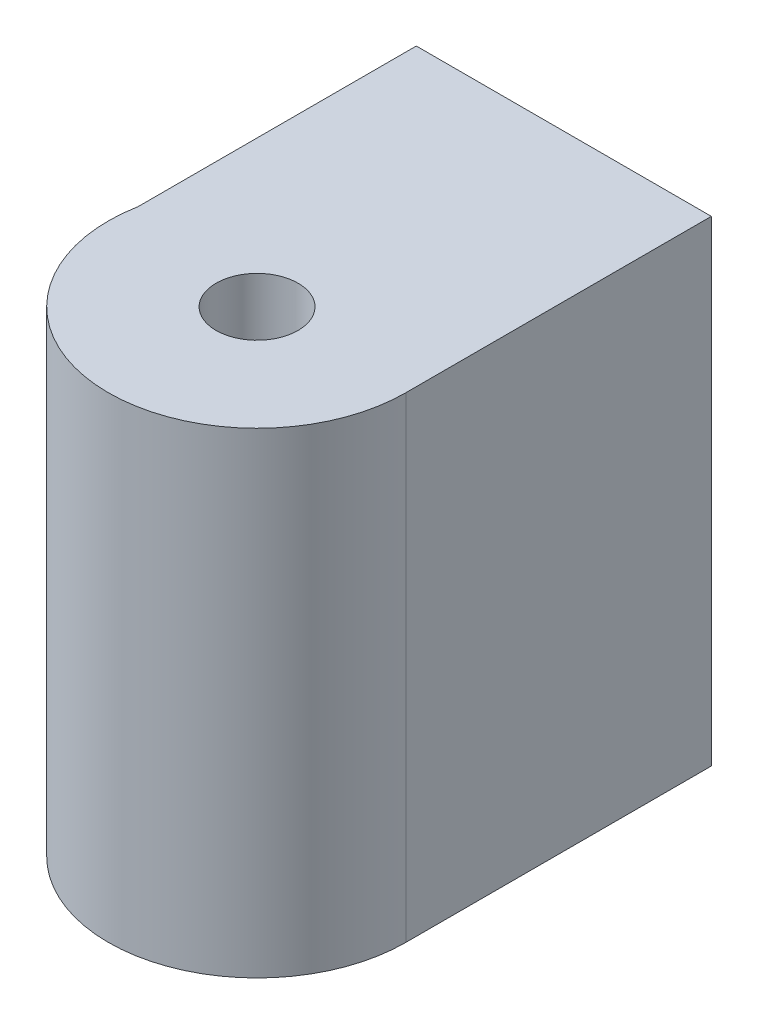
ISO-10303-21;
HEADER;
FILE_DESCRIPTION(('STEP AP214'),'2;1');
FILE_NAME('part.step','',(''),(''),'','','');
FILE_SCHEMA(('AUTOMOTIVE_DESIGN { 1 0 10303 214 1 1 1 1 }'));
ENDSEC;
DATA;
#1=APPLICATION_CONTEXT('core data for automotive mechanical design processes');
#2=APPLICATION_PROTOCOL_DEFINITION('international standard','automotive_design',2000,#1);
#3=PRODUCT_CONTEXT('',#1,'mechanical');
#4=PRODUCT('Part','Part','',(#3));
#5=PRODUCT_RELATED_PRODUCT_CATEGORY('part','',(#4));
#6=PRODUCT_DEFINITION_FORMATION('','',#4);
#7=PRODUCT_DEFINITION_CONTEXT('part definition',#1,'design');
#8=PRODUCT_DEFINITION('design','',#6,#7);
#9=PRODUCT_DEFINITION_SHAPE('','',#8);
#10=(LENGTH_UNIT() NAMED_UNIT(*) SI_UNIT(.MILLI.,.METRE.));
#11=(NAMED_UNIT(*) PLANE_ANGLE_UNIT() SI_UNIT($,.RADIAN.));
#12=(NAMED_UNIT(*) SI_UNIT($,.STERADIAN.) SOLID_ANGLE_UNIT());
#13=UNCERTAINTY_MEASURE_WITH_UNIT(LENGTH_MEASURE(1.E-05),#10,'distance_accuracy_value','');
#14=(GEOMETRIC_REPRESENTATION_CONTEXT(3) GLOBAL_UNCERTAINTY_ASSIGNED_CONTEXT((#13)) GLOBAL_UNIT_ASSIGNED_CONTEXT((#10,
#11,#12)) REPRESENTATION_CONTEXT('',''));
#15=CARTESIAN_POINT('',(0.,0.,0.));
#16=DIRECTION('',(0.,0.,1.));
#17=DIRECTION('',(1.,0.,0.));
#18=AXIS2_PLACEMENT_3D('',#15,#16,#17);
#19=CARTESIAN_POINT('',(-53.6939675410073,-2070.74992623645,-163.840329353942));
#20=DIRECTION('',(0.,-1.,0.));
#21=DIRECTION('',(1.,0.,0.));
#22=AXIS2_PLACEMENT_3D('',#19,#20,#21);
#23=CYLINDRICAL_SURFACE('',#22,12.7);
#24=CARTESIAN_POINT('',(-53.6939675410073,-2070.74992623645,-163.840329353942));
#25=DIRECTION('',(0.,1.,0.));
#26=DIRECTION('',(-1.,0.,0.));
#27=AXIS2_PLACEMENT_3D('',#24,#25,#26);
#28=CIRCLE('',#27,12.7);
#29=CARTESIAN_POINT('',(-66.179661452878,-2070.74992623645,-166.163570094605));
#30=VERTEX_POINT('',#29);
#31=CARTESIAN_POINT('',(-40.9939675410073,-2070.74992623645,-163.840329353942));
#32=VERTEX_POINT('',#31);
#33=EDGE_CURVE('E11',#30,#32,#28,.T.);
#34=ORIENTED_EDGE('',*,*,#33,.F.);
#35=DIRECTION('',(0.,-1.,0.));
#36=VECTOR('',#35,1.);
#37=CARTESIAN_POINT('',(-66.179661452878,-2101.38992623645,-166.163570094605));
#38=LINE('',#37,#36);
#39=CARTESIAN_POINT('',(-66.179661452878,-2111.38992623645,-166.163570094605));
#40=VERTEX_POINT('',#39);
#41=EDGE_CURVE('E46',#30,#40,#38,.T.);
#42=ORIENTED_EDGE('',*,*,#41,.T.);
#43=CARTESIAN_POINT('',(-53.6939675410073,-2111.38992623645,-163.840329353942));
#44=DIRECTION('',(0.,1.,0.));
#45=DIRECTION('',(-1.,0.,0.));
#46=AXIS2_PLACEMENT_3D('',#43,#44,#45);
#47=CIRCLE('',#46,12.7);
#48=CARTESIAN_POINT('',(-40.9939675410073,-2111.38992623645,-163.840329353942));
#49=VERTEX_POINT('',#48);
#50=EDGE_CURVE('E35',#40,#49,#47,.T.);
#51=ORIENTED_EDGE('',*,*,#50,.T.);
#52=DIRECTION('',(0.,-1.,0.));
#53=VECTOR('',#52,1.);
#54=CARTESIAN_POINT('',(-40.9939675410073,-2101.38992623645,-163.840329353942));
#55=LINE('',#54,#53);
#56=EDGE_CURVE('E53',#32,#49,#55,.T.);
#57=ORIENTED_EDGE('',*,*,#56,.F.);
#58=EDGE_LOOP('',(#34,#42,#51,#57));
#59=FACE_BOUND('',#58,.T.);
#60=ADVANCED_FACE('F32',(#59),#23,.T.);
#61=CARTESIAN_POINT('',(-53.6939675410073,-2070.74992623645,-163.840329353942));
#62=DIRECTION('',(0.,1.,0.));
#63=DIRECTION('',(-1.,0.,0.));
#64=AXIS2_PLACEMENT_3D('',#61,#62,#63);
#65=PLANE('',#64);
#66=ORIENTED_EDGE('',*,*,#33,.T.);
#67=DIRECTION('',(0.,0.,-1.));
#68=VECTOR('',#67,1.);
#69=CARTESIAN_POINT('',(-40.9939675410073,-2070.74992623645,-163.840329353942));
#70=LINE('',#69,#68);
#71=CARTESIAN_POINT('',(-40.9939675410073,-2070.74992623645,-189.919076926774));
#72=VERTEX_POINT('',#71);
#73=EDGE_CURVE('E151',#32,#72,#70,.T.);
#74=ORIENTED_EDGE('',*,*,#73,.T.);
#75=DIRECTION('',(-1.,0.,0.));
#76=VECTOR('',#75,1.);
#77=CARTESIAN_POINT('',(-66.179661452878,-2070.74992623645,-189.919076926774));
#78=LINE('',#77,#76);
#79=CARTESIAN_POINT('',(-66.179661452878,-2070.74992623645,-189.919076926774));
#80=VERTEX_POINT('',#79);
#81=EDGE_CURVE('E156',#72,#80,#78,.T.);
#82=ORIENTED_EDGE('',*,*,#81,.T.);
#83=DIRECTION('',(0.,0.,1.));
#84=VECTOR('',#83,1.);
#85=CARTESIAN_POINT('',(-66.179661452878,-2070.74992623645,-163.840329353942));
#86=LINE('',#85,#84);
#87=EDGE_CURVE('E152',#80,#30,#86,.T.);
#88=ORIENTED_EDGE('',*,*,#87,.T.);
#89=EDGE_LOOP('',(#66,#74,#82,#88));
#90=FACE_BOUND('',#89,.T.);
#91=CARTESIAN_POINT('',(-53.6939675410073,-2070.74992623645,-163.840329353942));
#92=DIRECTION('',(0.,1.,0.));
#93=DIRECTION('',(0.,0.,1.));
#94=AXIS2_PLACEMENT_3D('',#91,#92,#93);
#95=CIRCLE('',#94,3.5);
#96=CARTESIAN_POINT('',(-53.6939675410073,-2070.74992623645,-160.340329353942));
#97=VERTEX_POINT('',#96);
#98=EDGE_CURVE('E179',#97,#97,#95,.T.);
#99=ORIENTED_EDGE('',*,*,#98,.F.);
#100=EDGE_LOOP('',(#99));
#101=FACE_BOUND('',#100,.T.);
#102=ADVANCED_FACE('F212',(#90,#101),#65,.T.);
#103=CARTESIAN_POINT('',(-53.6939675410073,-2111.38992623645,-163.840329353942));
#104=DIRECTION('',(0.,1.,0.));
#105=DIRECTION('',(-1.,0.,0.));
#106=AXIS2_PLACEMENT_3D('',#103,#104,#105);
#107=PLANE('',#106);
#108=CARTESIAN_POINT('',(-61.9428595120541,-2111.38992623645,-159.077829353942));
#109=DIRECTION('',(0.,-1.,0.));
#110=DIRECTION('',(0.,0.,-1.));
#111=AXIS2_PLACEMENT_3D('',#108,#109,#110);
#112=CIRCLE('',#111,1.77799999999999);
#113=CARTESIAN_POINT('',(-61.9428595120541,-2111.38992623645,-160.855829353942));
#114=VERTEX_POINT('',#113);
#115=EDGE_CURVE('E180',#114,#114,#112,.T.);
#116=ORIENTED_EDGE('',*,*,#115,.F.);
#117=EDGE_LOOP('',(#116));
#118=FACE_BOUND('',#117,.T.);
#119=CARTESIAN_POINT('',(-53.6939675410073,-2111.38992623645,-173.365329353942));
#120=DIRECTION('',(0.,-1.,0.));
#121=DIRECTION('',(0.,0.,-1.));
#122=AXIS2_PLACEMENT_3D('',#119,#120,#121);
#123=CIRCLE('',#122,1.778);
#124=CARTESIAN_POINT('',(-53.6939675410073,-2111.38992623645,-175.143329353942));
#125=VERTEX_POINT('',#124);
#126=EDGE_CURVE('E186',#125,#125,#123,.T.);
#127=ORIENTED_EDGE('',*,*,#126,.F.);
#128=EDGE_LOOP('',(#127));
#129=FACE_BOUND('',#128,.T.);
#130=CARTESIAN_POINT('',(-45.4450755699605,-2111.38992623645,-159.077829353942));
#131=DIRECTION('',(0.,-1.,0.));
#132=DIRECTION('',(0.,0.,-1.));
#133=AXIS2_PLACEMENT_3D('',#130,#131,#132);
#134=CIRCLE('',#133,1.77799999999999);
#135=CARTESIAN_POINT('',(-45.4450755699605,-2111.38992623645,-160.855829353942));
#136=VERTEX_POINT('',#135);
#137=EDGE_CURVE('E174',#136,#136,#134,.T.);
#138=ORIENTED_EDGE('',*,*,#137,.F.);
#139=EDGE_LOOP('',(#138));
#140=FACE_BOUND('',#139,.T.);
#141=CARTESIAN_POINT('',(-53.6939675410073,-2111.38992623645,-163.840329353942));
#142=DIRECTION('',(0.,1.,0.));
#143=DIRECTION('',(-1.,0.,0.));
#144=AXIS2_PLACEMENT_3D('',#141,#142,#143);
#145=CIRCLE('',#144,3.5);
#146=CARTESIAN_POINT('',(-57.1939675410073,-2111.38992623645,-163.840329353942));
#147=VERTEX_POINT('',#146);
#148=EDGE_CURVE('E196',#147,#147,#145,.F.);
#149=ORIENTED_EDGE('',*,*,#148,.F.);
#150=EDGE_LOOP('',(#149));
#151=FACE_BOUND('',#150,.T.);
#152=ORIENTED_EDGE('',*,*,#50,.F.);
#153=DIRECTION('',(0.,0.,-1.));
#154=VECTOR('',#153,1.);
#155=CARTESIAN_POINT('',(-66.179661452878,-2111.38992623645,-166.163570094605));
#156=LINE('',#155,#154);
#157=CARTESIAN_POINT('',(-66.179661452878,-2111.38992623645,-189.919076926775));
#158=VERTEX_POINT('',#157);
#159=EDGE_CURVE('E168',#40,#158,#156,.T.);
#160=ORIENTED_EDGE('',*,*,#159,.T.);
#161=DIRECTION('',(1.,0.,0.));
#162=VECTOR('',#161,1.);
#163=CARTESIAN_POINT('',(-40.9939675410073,-2111.38992623645,-189.919076926775));
#164=LINE('',#163,#162);
#165=CARTESIAN_POINT('',(-40.9939675410073,-2111.38992623645,-189.919076926775));
#166=VERTEX_POINT('',#165);
#167=EDGE_CURVE('E163',#158,#166,#164,.T.);
#168=ORIENTED_EDGE('',*,*,#167,.T.);
#169=DIRECTION('',(0.,0.,1.));
#170=VECTOR('',#169,1.);
#171=CARTESIAN_POINT('',(-40.9939675410073,-2111.38992623645,-163.840329353942));
#172=LINE('',#171,#170);
#173=EDGE_CURVE('E170',#166,#49,#172,.T.);
#174=ORIENTED_EDGE('',*,*,#173,.T.);
#175=EDGE_LOOP('',(#152,#160,#168,#174));
#176=FACE_BOUND('',#175,.T.);
#177=ADVANCED_FACE('F205',(#118,#129,#140,#151,#176),#107,.F.);
#178=CARTESIAN_POINT('',(-53.6939675410073,-2121.28942117306,-163.840329353942));
#179=DIRECTION('',(0.,1.,0.));
#180=DIRECTION('',(0.,0.,1.));
#181=AXIS2_PLACEMENT_3D('',#178,#179,#180);
#182=CYLINDRICAL_SURFACE('',#181,3.5);
#183=ORIENTED_EDGE('',*,*,#148,.T.);
#184=EDGE_LOOP('',(#183));
#185=FACE_BOUND('',#184,.T.);
#186=ORIENTED_EDGE('',*,*,#98,.T.);
#187=EDGE_LOOP('',(#186));
#188=FACE_BOUND('',#187,.T.);
#189=ADVANCED_FACE('F218',(#185,#188),#182,.F.);
#190=CARTESIAN_POINT('',(-45.4450755699605,-2105.38992623645,-159.077829353942));
#191=DIRECTION('',(0.,-1.,0.));
#192=DIRECTION('',(0.,0.,-1.));
#193=AXIS2_PLACEMENT_3D('',#190,#191,#192);
#194=CYLINDRICAL_SURFACE('',#193,1.77799999999999);
#195=CARTESIAN_POINT('',(-45.4450755699605,-2105.38992623645,-159.077829353942));
#196=DIRECTION('',(0.,-1.,0.));
#197=DIRECTION('',(0.,0.,-1.));
#198=AXIS2_PLACEMENT_3D('',#195,#196,#197);
#199=CIRCLE('',#198,1.77799999999999);
#200=CARTESIAN_POINT('',(-45.4450755699605,-2105.38992623645,-160.855829353942));
#201=VERTEX_POINT('',#200);
#202=EDGE_CURVE('E189',#201,#201,#199,.T.);
#203=ORIENTED_EDGE('',*,*,#202,.F.);
#204=EDGE_LOOP('',(#203));
#205=FACE_BOUND('',#204,.T.);
#206=ORIENTED_EDGE('',*,*,#137,.T.);
#207=EDGE_LOOP('',(#206));
#208=FACE_BOUND('',#207,.T.);
#209=ADVANCED_FACE('F220',(#205,#208),#194,.F.);
#210=CARTESIAN_POINT('',(-45.4450755699605,-2105.38992623645,-159.077829353942));
#211=DIRECTION('',(0.,-1.,0.));
#212=DIRECTION('',(0.,0.,-1.));
#213=AXIS2_PLACEMENT_3D('',#210,#211,#212);
#214=PLANE('',#213);
#215=ORIENTED_EDGE('',*,*,#202,.T.);
#216=EDGE_LOOP('',(#215));
#217=FACE_BOUND('',#216,.T.);
#218=ADVANCED_FACE('F226',(#217),#214,.T.);
#219=CARTESIAN_POINT('',(-53.6939675410073,-2105.38992623645,-173.365329353942));
#220=DIRECTION('',(0.,-1.,0.));
#221=DIRECTION('',(0.,0.,-1.));
#222=AXIS2_PLACEMENT_3D('',#219,#220,#221);
#223=CYLINDRICAL_SURFACE('',#222,1.778);
#224=CARTESIAN_POINT('',(-53.6939675410073,-2105.38992623645,-173.365329353942));
#225=DIRECTION('',(0.,-1.,0.));
#226=DIRECTION('',(0.,0.,-1.));
#227=AXIS2_PLACEMENT_3D('',#224,#225,#226);
#228=CIRCLE('',#227,1.778);
#229=CARTESIAN_POINT('',(-53.6939675410073,-2105.38992623645,-175.143329353942));
#230=VERTEX_POINT('',#229);
#231=EDGE_CURVE('E183',#230,#230,#228,.T.);
#232=ORIENTED_EDGE('',*,*,#231,.F.);
#233=EDGE_LOOP('',(#232));
#234=FACE_BOUND('',#233,.T.);
#235=ORIENTED_EDGE('',*,*,#126,.T.);
#236=EDGE_LOOP('',(#235));
#237=FACE_BOUND('',#236,.T.);
#238=ADVANCED_FACE('F276',(#234,#237),#223,.F.);
#239=CARTESIAN_POINT('',(-53.6939675410073,-2105.38992623645,-173.365329353942));
#240=DIRECTION('',(0.,-1.,0.));
#241=DIRECTION('',(0.,0.,-1.));
#242=AXIS2_PLACEMENT_3D('',#239,#240,#241);
#243=PLANE('',#242);
#244=ORIENTED_EDGE('',*,*,#231,.T.);
#245=EDGE_LOOP('',(#244));
#246=FACE_BOUND('',#245,.T.);
#247=ADVANCED_FACE('F266',(#246),#243,.T.);
#248=CARTESIAN_POINT('',(-61.9428595120541,-2105.38992623645,-159.077829353942));
#249=DIRECTION('',(0.,-1.,0.));
#250=DIRECTION('',(0.,0.,-1.));
#251=AXIS2_PLACEMENT_3D('',#248,#249,#250);
#252=CYLINDRICAL_SURFACE('',#251,1.77799999999999);
#253=CARTESIAN_POINT('',(-61.9428595120541,-2105.38992623645,-159.077829353942));
#254=DIRECTION('',(0.,-1.,0.));
#255=DIRECTION('',(0.,0.,-1.));
#256=AXIS2_PLACEMENT_3D('',#253,#254,#255);
#257=CIRCLE('',#256,1.77799999999999);
#258=CARTESIAN_POINT('',(-61.9428595120541,-2105.38992623645,-160.855829353942));
#259=VERTEX_POINT('',#258);
#260=EDGE_CURVE('E176',#259,#259,#257,.T.);
#261=ORIENTED_EDGE('',*,*,#260,.F.);
#262=EDGE_LOOP('',(#261));
#263=FACE_BOUND('',#262,.T.);
#264=ORIENTED_EDGE('',*,*,#115,.T.);
#265=EDGE_LOOP('',(#264));
#266=FACE_BOUND('',#265,.T.);
#267=ADVANCED_FACE('F255',(#263,#266),#252,.F.);
#268=CARTESIAN_POINT('',(-61.9428595120541,-2105.38992623645,-159.077829353942));
#269=DIRECTION('',(0.,-1.,0.));
#270=DIRECTION('',(0.,0.,-1.));
#271=AXIS2_PLACEMENT_3D('',#268,#269,#270);
#272=PLANE('',#271);
#273=ORIENTED_EDGE('',*,*,#260,.T.);
#274=EDGE_LOOP('',(#273));
#275=FACE_BOUND('',#274,.T.);
#276=ADVANCED_FACE('F250',(#275),#272,.T.);
#277=CARTESIAN_POINT('',(-40.9939675410073,-2101.38992623645,-163.840329353942));
#278=DIRECTION('',(1.,0.,0.));
#279=DIRECTION('',(0.,1.,0.));
#280=AXIS2_PLACEMENT_3D('',#277,#278,#279);
#281=PLANE('',#280);
#282=ORIENTED_EDGE('',*,*,#173,.F.);
#283=DIRECTION('',(0.,1.,0.));
#284=VECTOR('',#283,1.);
#285=CARTESIAN_POINT('',(-40.9939675410073,-2101.38992623645,-189.919076926775));
#286=LINE('',#285,#284);
#287=EDGE_CURVE('E166',#166,#72,#286,.T.);
#288=ORIENTED_EDGE('',*,*,#287,.T.);
#289=ORIENTED_EDGE('',*,*,#73,.F.);
#290=ORIENTED_EDGE('',*,*,#56,.T.);
#291=EDGE_LOOP('',(#282,#288,#289,#290));
#292=FACE_BOUND('',#291,.T.);
#293=ADVANCED_FACE('F203',(#292),#281,.T.);
#294=CARTESIAN_POINT('',(-66.179661452878,-2101.38992623645,-166.163570094605));
#295=DIRECTION('',(-1.,0.,0.));
#296=DIRECTION('',(0.,-1.,0.));
#297=AXIS2_PLACEMENT_3D('',#294,#295,#296);
#298=PLANE('',#297);
#299=ORIENTED_EDGE('',*,*,#159,.F.);
#300=ORIENTED_EDGE('',*,*,#41,.F.);
#301=ORIENTED_EDGE('',*,*,#87,.F.);
#302=DIRECTION('',(0.,-1.,0.));
#303=VECTOR('',#302,1.);
#304=CARTESIAN_POINT('',(-66.179661452878,-2101.38992623645,-189.919076926775));
#305=LINE('',#304,#303);
#306=EDGE_CURVE('E155',#80,#158,#305,.T.);
#307=ORIENTED_EDGE('',*,*,#306,.T.);
#308=EDGE_LOOP('',(#299,#300,#301,#307));
#309=FACE_BOUND('',#308,.T.);
#310=ADVANCED_FACE('F210',(#309),#298,.T.);
#311=CARTESIAN_POINT('',(399.459604492078,-1664.88134965421,-189.919076926775));
#312=DIRECTION('',(0.,0.,1.));
#313=DIRECTION('',(-0.9999980793749,-0.00195990982184696,0.));
#314=AXIS2_PLACEMENT_3D('',#311,#312,#313);
#315=PLANE('',#314);
#316=CARTESIAN_POINT('',(-53.586814498129,-2106.38992623204,-189.919076926774));
#317=DIRECTION('',(0.,0.,-1.));
#318=DIRECTION('',(0.,1.,0.));
#319=AXIS2_PLACEMENT_3D('',#316,#317,#318);
#320=CIRCLE('',#319,3.15);
#321=CARTESIAN_POINT('',(-53.586814498129,-2103.23992623204,-189.919076926774));
#322=VERTEX_POINT('',#321);
#323=EDGE_CURVE('E106',#322,#322,#320,.T.);
#324=ORIENTED_EDGE('',*,*,#323,.F.);
#325=EDGE_LOOP('',(#324));
#326=FACE_BOUND('',#325,.T.);
#327=CARTESIAN_POINT('',(-62.6263575121822,-2106.38992623204,-189.919076926774));
#328=DIRECTION('',(0.,0.,-1.));
#329=DIRECTION('',(0.,1.,0.));
#330=AXIS2_PLACEMENT_3D('',#327,#328,#329);
#331=CIRCLE('',#330,3.15);
#332=CARTESIAN_POINT('',(-62.6263575121822,-2103.23992623204,-189.919076926774));
#333=VERTEX_POINT('',#332);
#334=EDGE_CURVE('E99',#333,#333,#331,.T.);
#335=ORIENTED_EDGE('',*,*,#334,.F.);
#336=EDGE_LOOP('',(#335));
#337=FACE_BOUND('',#336,.T.);
#338=CARTESIAN_POINT('',(-44.5472714840758,-2106.38992623204,-189.919076926774));
#339=DIRECTION('',(0.,0.,-1.));
#340=DIRECTION('',(0.,1.,0.));
#341=AXIS2_PLACEMENT_3D('',#338,#339,#340);
#342=CIRCLE('',#341,3.15);
#343=CARTESIAN_POINT('',(-44.5472714840758,-2103.23992623204,-189.919076926774));
#344=VERTEX_POINT('',#343);
#345=EDGE_CURVE('E115',#344,#344,#342,.T.);
#346=ORIENTED_EDGE('',*,*,#345,.F.);
#347=EDGE_LOOP('',(#346));
#348=FACE_BOUND('',#347,.T.);
#349=CARTESIAN_POINT('',(-53.586814498129,-2075.74992623645,-189.919076926774));
#350=DIRECTION('',(0.,0.,-1.));
#351=DIRECTION('',(0.,1.,0.));
#352=AXIS2_PLACEMENT_3D('',#349,#350,#351);
#353=CIRCLE('',#352,3.15);
#354=CARTESIAN_POINT('',(-53.586814498129,-2072.59992623645,-189.919076926774));
#355=VERTEX_POINT('',#354);
#356=EDGE_CURVE('E124',#355,#355,#353,.T.);
#357=ORIENTED_EDGE('',*,*,#356,.F.);
#358=EDGE_LOOP('',(#357));
#359=FACE_BOUND('',#358,.T.);
#360=CARTESIAN_POINT('',(-62.6263575121823,-2075.74992623645,-189.919076926774));
#361=DIRECTION('',(0.,0.,-1.));
#362=DIRECTION('',(0.,1.,0.));
#363=AXIS2_PLACEMENT_3D('',#360,#361,#362);
#364=CIRCLE('',#363,3.15);
#365=CARTESIAN_POINT('',(-62.6263575121823,-2072.59992623645,-189.919076926774));
#366=VERTEX_POINT('',#365);
#367=EDGE_CURVE('E133',#366,#366,#364,.T.);
#368=ORIENTED_EDGE('',*,*,#367,.F.);
#369=EDGE_LOOP('',(#368));
#370=FACE_BOUND('',#369,.T.);
#371=CARTESIAN_POINT('',(-44.5472714840758,-2075.74992623645,-189.919076926774));
#372=DIRECTION('',(0.,0.,-1.));
#373=DIRECTION('',(0.,1.,0.));
#374=AXIS2_PLACEMENT_3D('',#371,#372,#373);
#375=CIRCLE('',#374,3.15);
#376=CARTESIAN_POINT('',(-44.5472714840758,-2072.59992623645,-189.919076926774));
#377=VERTEX_POINT('',#376);
#378=EDGE_CURVE('E142',#377,#377,#375,.T.);
#379=ORIENTED_EDGE('',*,*,#378,.F.);
#380=EDGE_LOOP('',(#379));
#381=FACE_BOUND('',#380,.T.);
#382=ORIENTED_EDGE('',*,*,#167,.F.);
#383=ORIENTED_EDGE('',*,*,#306,.F.);
#384=ORIENTED_EDGE('',*,*,#81,.F.);
#385=ORIENTED_EDGE('',*,*,#287,.F.);
#386=EDGE_LOOP('',(#382,#383,#384,#385));
#387=FACE_BOUND('',#386,.T.);
#388=ADVANCED_FACE('F208',(#326,#337,#348,#359,#370,#381,#387),#315,.F.);
#389=CARTESIAN_POINT('',(-44.5472714840758,-2075.74992623645,-180.940539979121));
#390=DIRECTION('',(0.,0.,-1.));
#391=DIRECTION('',(0.,1.,0.));
#392=AXIS2_PLACEMENT_3D('',#389,#390,#391);
#393=CONICAL_SURFACE('',#392,1.7,1.02974425867666);
#394=CARTESIAN_POINT('',(-44.5472714840758,-2075.74992623645,-179.919076926774));
#395=VERTEX_POINT('',#394);
#396=VERTEX_LOOP('',#395);
#397=FACE_BOUND('',#396,.T.);
#398=CARTESIAN_POINT('',(-44.5472714840758,-2075.74992623645,-180.940539979121));
#399=DIRECTION('',(0.,0.,-1.));
#400=DIRECTION('',(0.,1.,0.));
#401=AXIS2_PLACEMENT_3D('',#398,#399,#400);
#402=CIRCLE('',#401,1.7);
#403=CARTESIAN_POINT('',(-44.5472714840758,-2074.04992623645,-180.940539979121));
#404=VERTEX_POINT('',#403);
#405=EDGE_CURVE('E148',#404,#404,#402,.T.);
#406=ORIENTED_EDGE('',*,*,#405,.T.);
#407=EDGE_LOOP('',(#406));
#408=FACE_BOUND('',#407,.T.);
#409=ADVANCED_FACE('F347',(#397,#408),#393,.F.);
#410=CARTESIAN_POINT('',(-44.5472714840758,-2075.74992623645,-189.919076926774));
#411=DIRECTION('',(0.,0.,-1.));
#412=DIRECTION('',(0.,1.,0.));
#413=AXIS2_PLACEMENT_3D('',#410,#411,#412);
#414=CYLINDRICAL_SURFACE('',#413,1.7);
#415=ORIENTED_EDGE('',*,*,#405,.F.);
#416=EDGE_LOOP('',(#415));
#417=FACE_BOUND('',#416,.T.);
#418=CARTESIAN_POINT('',(-44.5472714840758,-2075.74992623645,-188.469076926774));
#419=DIRECTION('',(0.,0.,-1.));
#420=DIRECTION('',(0.,1.,0.));
#421=AXIS2_PLACEMENT_3D('',#418,#419,#420);
#422=CIRCLE('',#421,1.69999999999999);
#423=CARTESIAN_POINT('',(-44.5472714840758,-2074.04992623645,-188.469076926774));
#424=VERTEX_POINT('',#423);
#425=EDGE_CURVE('E145',#424,#424,#422,.T.);
#426=ORIENTED_EDGE('',*,*,#425,.T.);
#427=EDGE_LOOP('',(#426));
#428=FACE_BOUND('',#427,.T.);
#429=ADVANCED_FACE('F357',(#417,#428),#414,.F.);
#430=CARTESIAN_POINT('',(-44.5472714840758,-2075.74992623645,-189.919076926774));
#431=DIRECTION('',(0.,0.,-1.));
#432=DIRECTION('',(0.,1.,0.));
#433=AXIS2_PLACEMENT_3D('',#430,#431,#432);
#434=CONICAL_SURFACE('',#433,3.15,0.785398163397448);
#435=ORIENTED_EDGE('',*,*,#425,.F.);
#436=EDGE_LOOP('',(#435));
#437=FACE_BOUND('',#436,.T.);
#438=ORIENTED_EDGE('',*,*,#378,.T.);
#439=EDGE_LOOP('',(#438));
#440=FACE_BOUND('',#439,.T.);
#441=ADVANCED_FACE('F366',(#437,#440),#434,.F.);
#442=CARTESIAN_POINT('',(-62.6263575121823,-2075.74992623645,-180.940539979121));
#443=DIRECTION('',(0.,0.,-1.));
#444=DIRECTION('',(0.,1.,0.));
#445=AXIS2_PLACEMENT_3D('',#442,#443,#444);
#446=CONICAL_SURFACE('',#445,1.7,1.02974425867666);
#447=CARTESIAN_POINT('',(-62.6263575121823,-2075.74992623645,-179.919076926774));
#448=VERTEX_POINT('',#447);
#449=VERTEX_LOOP('',#448);
#450=FACE_BOUND('',#449,.T.);
#451=CARTESIAN_POINT('',(-62.6263575121823,-2075.74992623645,-180.940539979121));
#452=DIRECTION('',(0.,0.,-1.));
#453=DIRECTION('',(0.,1.,0.));
#454=AXIS2_PLACEMENT_3D('',#451,#452,#453);
#455=CIRCLE('',#454,1.7);
#456=CARTESIAN_POINT('',(-62.6263575121823,-2074.04992623645,-180.940539979121));
#457=VERTEX_POINT('',#456);
#458=EDGE_CURVE('E139',#457,#457,#455,.T.);
#459=ORIENTED_EDGE('',*,*,#458,.T.);
#460=EDGE_LOOP('',(#459));
#461=FACE_BOUND('',#460,.T.);
#462=ADVANCED_FACE('F375',(#450,#461),#446,.F.);
#463=CARTESIAN_POINT('',(-62.6263575121823,-2075.74992623645,-189.919076926774));
#464=DIRECTION('',(0.,0.,-1.));
#465=DIRECTION('',(0.,1.,0.));
#466=AXIS2_PLACEMENT_3D('',#463,#464,#465);
#467=CYLINDRICAL_SURFACE('',#466,1.7);
#468=ORIENTED_EDGE('',*,*,#458,.F.);
#469=EDGE_LOOP('',(#468));
#470=FACE_BOUND('',#469,.T.);
#471=CARTESIAN_POINT('',(-62.6263575121823,-2075.74992623645,-188.469076926774));
#472=DIRECTION('',(0.,0.,-1.));
#473=DIRECTION('',(0.,1.,0.));
#474=AXIS2_PLACEMENT_3D('',#471,#472,#473);
#475=CIRCLE('',#474,1.69999999999999);
#476=CARTESIAN_POINT('',(-62.6263575121823,-2074.04992623645,-188.469076926774));
#477=VERTEX_POINT('',#476);
#478=EDGE_CURVE('E136',#477,#477,#475,.T.);
#479=ORIENTED_EDGE('',*,*,#478,.T.);
#480=EDGE_LOOP('',(#479));
#481=FACE_BOUND('',#480,.T.);
#482=ADVANCED_FACE('F384',(#470,#481),#467,.F.);
#483=CARTESIAN_POINT('',(-62.6263575121823,-2075.74992623645,-189.919076926774));
#484=DIRECTION('',(0.,0.,-1.));
#485=DIRECTION('',(0.,1.,0.));
#486=AXIS2_PLACEMENT_3D('',#483,#484,#485);
#487=CONICAL_SURFACE('',#486,3.15,0.785398163397448);
#488=ORIENTED_EDGE('',*,*,#478,.F.);
#489=EDGE_LOOP('',(#488));
#490=FACE_BOUND('',#489,.T.);
#491=ORIENTED_EDGE('',*,*,#367,.T.);
#492=EDGE_LOOP('',(#491));
#493=FACE_BOUND('',#492,.T.);
#494=ADVANCED_FACE('F393',(#490,#493),#487,.F.);
#495=CARTESIAN_POINT('',(-53.586814498129,-2075.74992623645,-180.940539979121));
#496=DIRECTION('',(0.,0.,-1.));
#497=DIRECTION('',(0.,1.,0.));
#498=AXIS2_PLACEMENT_3D('',#495,#496,#497);
#499=CONICAL_SURFACE('',#498,1.7,1.02974425867666);
#500=CARTESIAN_POINT('',(-53.586814498129,-2075.74992623645,-179.919076926774));
#501=VERTEX_POINT('',#500);
#502=VERTEX_LOOP('',#501);
#503=FACE_BOUND('',#502,.T.);
#504=CARTESIAN_POINT('',(-53.586814498129,-2075.74992623645,-180.940539979121));
#505=DIRECTION('',(0.,0.,-1.));
#506=DIRECTION('',(0.,1.,0.));
#507=AXIS2_PLACEMENT_3D('',#504,#505,#506);
#508=CIRCLE('',#507,1.7);
#509=CARTESIAN_POINT('',(-53.586814498129,-2074.04992623645,-180.940539979121));
#510=VERTEX_POINT('',#509);
#511=EDGE_CURVE('E130',#510,#510,#508,.T.);
#512=ORIENTED_EDGE('',*,*,#511,.T.);
#513=EDGE_LOOP('',(#512));
#514=FACE_BOUND('',#513,.T.);
#515=ADVANCED_FACE('F402',(#503,#514),#499,.F.);
#516=CARTESIAN_POINT('',(-53.586814498129,-2075.74992623645,-189.919076926774));
#517=DIRECTION('',(0.,0.,-1.));
#518=DIRECTION('',(0.,1.,0.));
#519=AXIS2_PLACEMENT_3D('',#516,#517,#518);
#520=CYLINDRICAL_SURFACE('',#519,1.7);
#521=ORIENTED_EDGE('',*,*,#511,.F.);
#522=EDGE_LOOP('',(#521));
#523=FACE_BOUND('',#522,.T.);
#524=CARTESIAN_POINT('',(-53.586814498129,-2075.74992623645,-188.469076926774));
#525=DIRECTION('',(0.,0.,-1.));
#526=DIRECTION('',(0.,1.,0.));
#527=AXIS2_PLACEMENT_3D('',#524,#525,#526);
#528=CIRCLE('',#527,1.69999999999999);
#529=CARTESIAN_POINT('',(-53.586814498129,-2074.04992623645,-188.469076926774));
#530=VERTEX_POINT('',#529);
#531=EDGE_CURVE('E127',#530,#530,#528,.T.);
#532=ORIENTED_EDGE('',*,*,#531,.T.);
#533=EDGE_LOOP('',(#532));
#534=FACE_BOUND('',#533,.T.);
#535=ADVANCED_FACE('F411',(#523,#534),#520,.F.);
#536=CARTESIAN_POINT('',(-53.586814498129,-2075.74992623645,-189.919076926774));
#537=DIRECTION('',(0.,0.,-1.));
#538=DIRECTION('',(0.,1.,0.));
#539=AXIS2_PLACEMENT_3D('',#536,#537,#538);
#540=CONICAL_SURFACE('',#539,3.15,0.785398163397448);
#541=ORIENTED_EDGE('',*,*,#531,.F.);
#542=EDGE_LOOP('',(#541));
#543=FACE_BOUND('',#542,.T.);
#544=ORIENTED_EDGE('',*,*,#356,.T.);
#545=EDGE_LOOP('',(#544));
#546=FACE_BOUND('',#545,.T.);
#547=ADVANCED_FACE('F420',(#543,#546),#540,.F.);
#548=CARTESIAN_POINT('',(-44.5472714840758,-2106.38992623204,-180.940539979121));
#549=DIRECTION('',(0.,0.,-1.));
#550=DIRECTION('',(0.,1.,0.));
#551=AXIS2_PLACEMENT_3D('',#548,#549,#550);
#552=CONICAL_SURFACE('',#551,1.7,1.02974425867666);
#553=CARTESIAN_POINT('',(-44.5472714840758,-2106.38992623204,-179.919076926774));
#554=VERTEX_POINT('',#553);
#555=VERTEX_LOOP('',#554);
#556=FACE_BOUND('',#555,.T.);
#557=CARTESIAN_POINT('',(-44.5472714840758,-2106.38992623204,-180.940539979121));
#558=DIRECTION('',(0.,0.,-1.));
#559=DIRECTION('',(0.,1.,0.));
#560=AXIS2_PLACEMENT_3D('',#557,#558,#559);
#561=CIRCLE('',#560,1.7);
#562=CARTESIAN_POINT('',(-44.5472714840758,-2104.68992623204,-180.940539979121));
#563=VERTEX_POINT('',#562);
#564=EDGE_CURVE('E121',#563,#563,#561,.T.);
#565=ORIENTED_EDGE('',*,*,#564,.T.);
#566=EDGE_LOOP('',(#565));
#567=FACE_BOUND('',#566,.T.);
#568=ADVANCED_FACE('F428',(#556,#567),#552,.F.);
#569=CARTESIAN_POINT('',(-44.5472714840758,-2106.38992623204,-189.919076926774));
#570=DIRECTION('',(0.,0.,-1.));
#571=DIRECTION('',(0.,1.,0.));
#572=AXIS2_PLACEMENT_3D('',#569,#570,#571);
#573=CYLINDRICAL_SURFACE('',#572,1.7);
#574=ORIENTED_EDGE('',*,*,#564,.F.);
#575=EDGE_LOOP('',(#574));
#576=FACE_BOUND('',#575,.T.);
#577=CARTESIAN_POINT('',(-44.5472714840758,-2106.38992623204,-188.469076926774));
#578=DIRECTION('',(0.,0.,-1.));
#579=DIRECTION('',(0.,1.,0.));
#580=AXIS2_PLACEMENT_3D('',#577,#578,#579);
#581=CIRCLE('',#580,1.69999999999999);
#582=CARTESIAN_POINT('',(-44.5472714840758,-2104.68992623204,-188.469076926774));
#583=VERTEX_POINT('',#582);
#584=EDGE_CURVE('E118',#583,#583,#581,.T.);
#585=ORIENTED_EDGE('',*,*,#584,.T.);
#586=EDGE_LOOP('',(#585));
#587=FACE_BOUND('',#586,.T.);
#588=ADVANCED_FACE('F436',(#576,#587),#573,.F.);
#589=CARTESIAN_POINT('',(-44.5472714840758,-2106.38992623204,-189.919076926774));
#590=DIRECTION('',(0.,0.,-1.));
#591=DIRECTION('',(0.,1.,0.));
#592=AXIS2_PLACEMENT_3D('',#589,#590,#591);
#593=CONICAL_SURFACE('',#592,3.15,0.785398163397448);
#594=ORIENTED_EDGE('',*,*,#584,.F.);
#595=EDGE_LOOP('',(#594));
#596=FACE_BOUND('',#595,.T.);
#597=ORIENTED_EDGE('',*,*,#345,.T.);
#598=EDGE_LOOP('',(#597));
#599=FACE_BOUND('',#598,.T.);
#600=ADVANCED_FACE('F445',(#596,#599),#593,.F.);
#601=CARTESIAN_POINT('',(-62.6263575121822,-2106.38992623204,-180.940539979121));
#602=DIRECTION('',(0.,0.,-1.));
#603=DIRECTION('',(0.,1.,0.));
#604=AXIS2_PLACEMENT_3D('',#601,#602,#603);
#605=CONICAL_SURFACE('',#604,1.7,1.02974425867666);
#606=CARTESIAN_POINT('',(-62.6263575121822,-2106.38992623204,-179.919076926774));
#607=VERTEX_POINT('',#606);
#608=VERTEX_LOOP('',#607);
#609=FACE_BOUND('',#608,.T.);
#610=CARTESIAN_POINT('',(-62.6263575121822,-2106.38992623204,-180.940539979121));
#611=DIRECTION('',(0.,0.,-1.));
#612=DIRECTION('',(0.,1.,0.));
#613=AXIS2_PLACEMENT_3D('',#610,#611,#612);
#614=CIRCLE('',#613,1.7);
#615=CARTESIAN_POINT('',(-62.6263575121822,-2104.68992623204,-180.940539979121));
#616=VERTEX_POINT('',#615);
#617=EDGE_CURVE('E112',#616,#616,#614,.T.);
#618=ORIENTED_EDGE('',*,*,#617,.T.);
#619=EDGE_LOOP('',(#618));
#620=FACE_BOUND('',#619,.T.);
#621=ADVANCED_FACE('F454',(#609,#620),#605,.F.);
#622=CARTESIAN_POINT('',(-62.6263575121822,-2106.38992623204,-189.919076926774));
#623=DIRECTION('',(0.,0.,-1.));
#624=DIRECTION('',(0.,1.,0.));
#625=AXIS2_PLACEMENT_3D('',#622,#623,#624);
#626=CYLINDRICAL_SURFACE('',#625,1.7);
#627=ORIENTED_EDGE('',*,*,#617,.F.);
#628=EDGE_LOOP('',(#627));
#629=FACE_BOUND('',#628,.T.);
#630=CARTESIAN_POINT('',(-62.6263575121822,-2106.38992623204,-188.469076926774));
#631=DIRECTION('',(0.,0.,-1.));
#632=DIRECTION('',(0.,1.,0.));
#633=AXIS2_PLACEMENT_3D('',#630,#631,#632);
#634=CIRCLE('',#633,1.69999999999999);
#635=CARTESIAN_POINT('',(-62.6263575121822,-2104.68992623204,-188.469076926774));
#636=VERTEX_POINT('',#635);
#637=EDGE_CURVE('E103',#636,#636,#634,.T.);
#638=ORIENTED_EDGE('',*,*,#637,.T.);
#639=EDGE_LOOP('',(#638));
#640=FACE_BOUND('',#639,.T.);
#641=ADVANCED_FACE('F463',(#629,#640),#626,.F.);
#642=CARTESIAN_POINT('',(-62.6263575121822,-2106.38992623204,-189.919076926774));
#643=DIRECTION('',(0.,0.,-1.));
#644=DIRECTION('',(0.,1.,0.));
#645=AXIS2_PLACEMENT_3D('',#642,#643,#644);
#646=CONICAL_SURFACE('',#645,3.15,0.785398163397448);
#647=ORIENTED_EDGE('',*,*,#637,.F.);
#648=EDGE_LOOP('',(#647));
#649=FACE_BOUND('',#648,.T.);
#650=ORIENTED_EDGE('',*,*,#334,.T.);
#651=EDGE_LOOP('',(#650));
#652=FACE_BOUND('',#651,.T.);
#653=ADVANCED_FACE('F93',(#649,#652),#646,.F.);
#654=CARTESIAN_POINT('',(-53.586814498129,-2106.38992623204,-180.940539979121));
#655=DIRECTION('',(0.,0.,-1.));
#656=DIRECTION('',(0.,1.,0.));
#657=AXIS2_PLACEMENT_3D('',#654,#655,#656);
#658=CONICAL_SURFACE('',#657,1.7,1.02974425867666);
#659=CARTESIAN_POINT('',(-53.586814498129,-2106.38992623204,-179.919076926774));
#660=VERTEX_POINT('',#659);
#661=VERTEX_LOOP('',#660);
#662=FACE_BOUND('',#661,.T.);
#663=CARTESIAN_POINT('',(-53.586814498129,-2106.38992623204,-180.940539979121));
#664=DIRECTION('',(0.,0.,-1.));
#665=DIRECTION('',(0.,1.,0.));
#666=AXIS2_PLACEMENT_3D('',#663,#664,#665);
#667=CIRCLE('',#666,1.7);
#668=CARTESIAN_POINT('',(-53.586814498129,-2104.68992623204,-180.940539979121));
#669=VERTEX_POINT('',#668);
#670=EDGE_CURVE('E97',#669,#669,#667,.T.);
#671=ORIENTED_EDGE('',*,*,#670,.T.);
#672=EDGE_LOOP('',(#671));
#673=FACE_BOUND('',#672,.T.);
#674=ADVANCED_FACE('F89',(#662,#673),#658,.F.);
#675=CARTESIAN_POINT('',(-53.586814498129,-2106.38992623204,-189.919076926774));
#676=DIRECTION('',(0.,0.,-1.));
#677=DIRECTION('',(0.,1.,0.));
#678=AXIS2_PLACEMENT_3D('',#675,#676,#677);
#679=CYLINDRICAL_SURFACE('',#678,1.7);
#680=ORIENTED_EDGE('',*,*,#670,.F.);
#681=EDGE_LOOP('',(#680));
#682=FACE_BOUND('',#681,.T.);
#683=CARTESIAN_POINT('',(-53.586814498129,-2106.38992623204,-188.469076926774));
#684=DIRECTION('',(0.,0.,-1.));
#685=DIRECTION('',(0.,1.,0.));
#686=AXIS2_PLACEMENT_3D('',#683,#684,#685);
#687=CIRCLE('',#686,1.69999999999999);
#688=CARTESIAN_POINT('',(-53.586814498129,-2104.68992623204,-188.469076926774));
#689=VERTEX_POINT('',#688);
#690=EDGE_CURVE('E100',#689,#689,#687,.T.);
#691=ORIENTED_EDGE('',*,*,#690,.T.);
#692=EDGE_LOOP('',(#691));
#693=FACE_BOUND('',#692,.T.);
#694=ADVANCED_FACE('F92',(#682,#693),#679,.F.);
#695=CARTESIAN_POINT('',(-53.586814498129,-2106.38992623204,-189.919076926774));
#696=DIRECTION('',(0.,0.,-1.));
#697=DIRECTION('',(0.,1.,0.));
#698=AXIS2_PLACEMENT_3D('',#695,#696,#697);
#699=CONICAL_SURFACE('',#698,3.15,0.785398163397448);
#700=ORIENTED_EDGE('',*,*,#690,.F.);
#701=EDGE_LOOP('',(#700));
#702=FACE_BOUND('',#701,.T.);
#703=ORIENTED_EDGE('',*,*,#323,.T.);
#704=EDGE_LOOP('',(#703));
#705=FACE_BOUND('',#704,.T.);
#706=ADVANCED_FACE('F493',(#702,#705),#699,.F.);
#707=CLOSED_SHELL('',(#60,#102,#177,#189,#209,#218,#238,#247,#267,#276,#293,#310,#388,#409,#429,
#441,#462,#482,#494,#515,#535,#547,#568,#588,#600,#621,#641,#653,#674,#694,#706));
#708=MANIFOLD_SOLID_BREP('B2',#707);
#709=ADVANCED_BREP_SHAPE_REPRESENTATION('',(#18,#708),#14);
#710=SHAPE_DEFINITION_REPRESENTATION(#9,#709);
ENDSEC;
END-ISO-10303-21;
